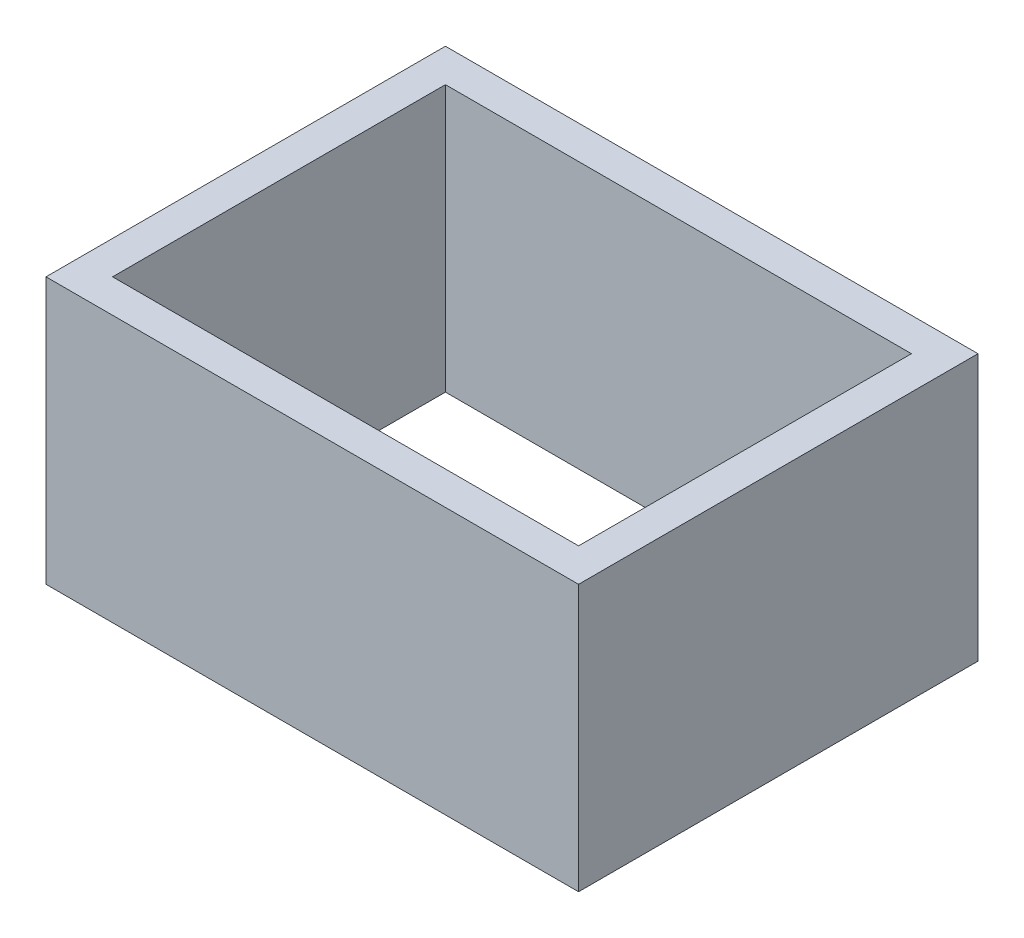
ISO-10303-21;
HEADER;
FILE_DESCRIPTION(('STEP AP214'),'2;1');
FILE_NAME('part.step','',(''),(''),'','','');
FILE_SCHEMA(('AUTOMOTIVE_DESIGN { 1 0 10303 214 1 1 1 1 }'));
ENDSEC;
DATA;
#1=APPLICATION_CONTEXT('core data for automotive mechanical design processes');
#2=APPLICATION_PROTOCOL_DEFINITION('international standard','automotive_design',2000,#1);
#3=PRODUCT_CONTEXT('',#1,'mechanical');
#4=PRODUCT('Part','Part','',(#3));
#5=PRODUCT_RELATED_PRODUCT_CATEGORY('part','',(#4));
#6=PRODUCT_DEFINITION_FORMATION('','',#4);
#7=PRODUCT_DEFINITION_CONTEXT('part definition',#1,'design');
#8=PRODUCT_DEFINITION('design','',#6,#7);
#9=PRODUCT_DEFINITION_SHAPE('','',#8);
#10=(LENGTH_UNIT() NAMED_UNIT(*) SI_UNIT(.MILLI.,.METRE.));
#11=(NAMED_UNIT(*) PLANE_ANGLE_UNIT() SI_UNIT($,.RADIAN.));
#12=(NAMED_UNIT(*) SI_UNIT($,.STERADIAN.) SOLID_ANGLE_UNIT());
#13=UNCERTAINTY_MEASURE_WITH_UNIT(LENGTH_MEASURE(1.E-05),#10,'distance_accuracy_value','');
#14=(GEOMETRIC_REPRESENTATION_CONTEXT(3) GLOBAL_UNCERTAINTY_ASSIGNED_CONTEXT((#13)) GLOBAL_UNIT_ASSIGNED_CONTEXT((#10,
#11,#12)) REPRESENTATION_CONTEXT('',''));
#15=CARTESIAN_POINT('',(0.,0.,0.));
#16=DIRECTION('',(0.,0.,1.));
#17=DIRECTION('',(1.,0.,0.));
#18=AXIS2_PLACEMENT_3D('',#15,#16,#17);
#19=CARTESIAN_POINT('',(25.4,25.4,-19.05));
#20=DIRECTION('',(-1.,0.,0.));
#21=DIRECTION('',(0.,0.,1.));
#22=AXIS2_PLACEMENT_3D('',#19,#20,#21);
#23=PLANE('',#22);
#24=DIRECTION('',(0.,0.,-1.));
#25=VECTOR('',#24,1.);
#26=CARTESIAN_POINT('',(25.4,0.,-19.05));
#27=LINE('',#26,#25);
#28=CARTESIAN_POINT('',(25.4,0.,19.05));
#29=VERTEX_POINT('',#28);
#30=CARTESIAN_POINT('',(25.4,0.,-19.05));
#31=VERTEX_POINT('',#30);
#32=EDGE_CURVE('E145',#29,#31,#27,.T.);
#33=ORIENTED_EDGE('',*,*,#32,.T.);
#34=DIRECTION('',(0.,-1.,0.));
#35=VECTOR('',#34,1.);
#36=CARTESIAN_POINT('',(25.4,25.4,-19.05));
#37=LINE('',#36,#35);
#38=CARTESIAN_POINT('',(25.4,25.4,-19.05));
#39=VERTEX_POINT('',#38);
#40=EDGE_CURVE('E11',#39,#31,#37,.T.);
#41=ORIENTED_EDGE('',*,*,#40,.F.);
#42=DIRECTION('',(0.,0.,-1.));
#43=VECTOR('',#42,1.);
#44=CARTESIAN_POINT('',(25.4,25.4,-19.05));
#45=LINE('',#44,#43);
#46=CARTESIAN_POINT('',(25.4,25.4,19.05));
#47=VERTEX_POINT('',#46);
#48=EDGE_CURVE('E134',#47,#39,#45,.T.);
#49=ORIENTED_EDGE('',*,*,#48,.F.);
#50=DIRECTION('',(0.,-1.,0.));
#51=VECTOR('',#50,1.);
#52=CARTESIAN_POINT('',(25.4,25.4,19.05));
#53=LINE('',#52,#51);
#54=EDGE_CURVE('E144',#47,#29,#53,.T.);
#55=ORIENTED_EDGE('',*,*,#54,.T.);
#56=EDGE_LOOP('',(#33,#41,#49,#55));
#57=FACE_BOUND('',#56,.T.);
#58=ADVANCED_FACE('F37',(#57),#23,.F.);
#59=CARTESIAN_POINT('',(-25.4,25.4,-19.05));
#60=DIRECTION('',(0.,0.,1.));
#61=DIRECTION('',(1.,0.,0.));
#62=AXIS2_PLACEMENT_3D('',#59,#60,#61);
#63=PLANE('',#62);
#64=DIRECTION('',(-1.,0.,0.));
#65=VECTOR('',#64,1.);
#66=CARTESIAN_POINT('',(-25.4,0.,-19.05));
#67=LINE('',#66,#65);
#68=CARTESIAN_POINT('',(-25.4,0.,-19.05));
#69=VERTEX_POINT('',#68);
#70=EDGE_CURVE('E148',#31,#69,#67,.T.);
#71=ORIENTED_EDGE('',*,*,#70,.T.);
#72=DIRECTION('',(0.,-1.,0.));
#73=VECTOR('',#72,1.);
#74=CARTESIAN_POINT('',(-25.4,25.4,-19.05));
#75=LINE('',#74,#73);
#76=CARTESIAN_POINT('',(-25.4,25.4,-19.05));
#77=VERTEX_POINT('',#76);
#78=EDGE_CURVE('E44',#77,#69,#75,.T.);
#79=ORIENTED_EDGE('',*,*,#78,.F.);
#80=DIRECTION('',(-1.,0.,0.));
#81=VECTOR('',#80,1.);
#82=CARTESIAN_POINT('',(-25.4,25.4,-19.05));
#83=LINE('',#82,#81);
#84=EDGE_CURVE('E137',#39,#77,#83,.T.);
#85=ORIENTED_EDGE('',*,*,#84,.F.);
#86=ORIENTED_EDGE('',*,*,#40,.T.);
#87=EDGE_LOOP('',(#71,#79,#85,#86));
#88=FACE_BOUND('',#87,.T.);
#89=ADVANCED_FACE('F176',(#88),#63,.F.);
#90=CARTESIAN_POINT('',(-25.4,25.4,-19.05));
#91=DIRECTION('',(1.,0.,0.));
#92=DIRECTION('',(0.,0.,-1.));
#93=AXIS2_PLACEMENT_3D('',#90,#91,#92);
#94=PLANE('',#93);
#95=DIRECTION('',(0.,0.,1.));
#96=VECTOR('',#95,1.);
#97=CARTESIAN_POINT('',(-25.4,0.,-19.05));
#98=LINE('',#97,#96);
#99=CARTESIAN_POINT('',(-25.4,0.,19.05));
#100=VERTEX_POINT('',#99);
#101=EDGE_CURVE('E150',#69,#100,#98,.T.);
#102=ORIENTED_EDGE('',*,*,#101,.T.);
#103=DIRECTION('',(0.,-1.,0.));
#104=VECTOR('',#103,1.);
#105=CARTESIAN_POINT('',(-25.4,25.4,19.05));
#106=LINE('',#105,#104);
#107=CARTESIAN_POINT('',(-25.4,25.4,19.05));
#108=VERTEX_POINT('',#107);
#109=EDGE_CURVE('E155',#108,#100,#106,.T.);
#110=ORIENTED_EDGE('',*,*,#109,.F.);
#111=DIRECTION('',(0.,0.,1.));
#112=VECTOR('',#111,1.);
#113=CARTESIAN_POINT('',(-25.4,25.4,-19.05));
#114=LINE('',#113,#112);
#115=EDGE_CURVE('E140',#77,#108,#114,.T.);
#116=ORIENTED_EDGE('',*,*,#115,.F.);
#117=ORIENTED_EDGE('',*,*,#78,.T.);
#118=EDGE_LOOP('',(#102,#110,#116,#117));
#119=FACE_BOUND('',#118,.T.);
#120=ADVANCED_FACE('F162',(#119),#94,.F.);
#121=CARTESIAN_POINT('',(-25.4,25.4,19.05));
#122=DIRECTION('',(0.,0.,-1.));
#123=DIRECTION('',(-1.,0.,0.));
#124=AXIS2_PLACEMENT_3D('',#121,#122,#123);
#125=PLANE('',#124);
#126=DIRECTION('',(1.,0.,0.));
#127=VECTOR('',#126,1.);
#128=CARTESIAN_POINT('',(-25.4,0.,19.05));
#129=LINE('',#128,#127);
#130=EDGE_CURVE('E138',#100,#29,#129,.T.);
#131=ORIENTED_EDGE('',*,*,#130,.T.);
#132=ORIENTED_EDGE('',*,*,#54,.F.);
#133=DIRECTION('',(1.,0.,0.));
#134=VECTOR('',#133,1.);
#135=CARTESIAN_POINT('',(-25.4,25.4,19.05));
#136=LINE('',#135,#134);
#137=EDGE_CURVE('E142',#108,#47,#136,.T.);
#138=ORIENTED_EDGE('',*,*,#137,.F.);
#139=ORIENTED_EDGE('',*,*,#109,.T.);
#140=EDGE_LOOP('',(#131,#132,#138,#139));
#141=FACE_BOUND('',#140,.T.);
#142=ADVANCED_FACE('F169',(#141),#125,.F.);
#143=CARTESIAN_POINT('',(0.,25.4,0.));
#144=DIRECTION('',(0.,1.,0.));
#145=DIRECTION('',(0.,0.,1.));
#146=AXIS2_PLACEMENT_3D('',#143,#144,#145);
#147=PLANE('',#146);
#148=DIRECTION('',(0.,0.,-1.));
#149=VECTOR('',#148,1.);
#150=CARTESIAN_POINT('',(22.225,25.4,-19.05));
#151=LINE('',#150,#149);
#152=CARTESIAN_POINT('',(22.225,25.4,15.875));
#153=VERTEX_POINT('',#152);
#154=CARTESIAN_POINT('',(22.225,25.4,-15.875));
#155=VERTEX_POINT('',#154);
#156=EDGE_CURVE('E122',#153,#155,#151,.T.);
#157=ORIENTED_EDGE('',*,*,#156,.F.);
#158=DIRECTION('',(1.,0.,0.));
#159=VECTOR('',#158,1.);
#160=CARTESIAN_POINT('',(-25.4,25.4,15.875));
#161=LINE('',#160,#159);
#162=CARTESIAN_POINT('',(-22.225,25.4,15.875));
#163=VERTEX_POINT('',#162);
#164=EDGE_CURVE('E106',#163,#153,#161,.T.);
#165=ORIENTED_EDGE('',*,*,#164,.F.);
#166=DIRECTION('',(0.,0.,1.));
#167=VECTOR('',#166,1.);
#168=CARTESIAN_POINT('',(-22.225,25.4,-19.05));
#169=LINE('',#168,#167);
#170=CARTESIAN_POINT('',(-22.225,25.4,-15.875));
#171=VERTEX_POINT('',#170);
#172=EDGE_CURVE('E131',#171,#163,#169,.T.);
#173=ORIENTED_EDGE('',*,*,#172,.F.);
#174=DIRECTION('',(-1.,0.,0.));
#175=VECTOR('',#174,1.);
#176=CARTESIAN_POINT('',(-25.4,25.4,-15.875));
#177=LINE('',#176,#175);
#178=EDGE_CURVE('E124',#155,#171,#177,.T.);
#179=ORIENTED_EDGE('',*,*,#178,.F.);
#180=EDGE_LOOP('',(#157,#165,#173,#179));
#181=FACE_BOUND('',#180,.T.);
#182=ORIENTED_EDGE('',*,*,#48,.T.);
#183=ORIENTED_EDGE('',*,*,#84,.T.);
#184=ORIENTED_EDGE('',*,*,#115,.T.);
#185=ORIENTED_EDGE('',*,*,#137,.T.);
#186=EDGE_LOOP('',(#182,#183,#184,#185));
#187=FACE_BOUND('',#186,.T.);
#188=ADVANCED_FACE('F175',(#181,#187),#147,.T.);
#189=CARTESIAN_POINT('',(0.,0.,0.));
#190=DIRECTION('',(0.,1.,0.));
#191=DIRECTION('',(0.,0.,1.));
#192=AXIS2_PLACEMENT_3D('',#189,#190,#191);
#193=PLANE('',#192);
#194=DIRECTION('',(1.,0.,0.));
#195=VECTOR('',#194,1.);
#196=CARTESIAN_POINT('',(-25.4,0.,15.875));
#197=LINE('',#196,#195);
#198=CARTESIAN_POINT('',(-22.225,0.,15.875));
#199=VERTEX_POINT('',#198);
#200=CARTESIAN_POINT('',(22.225,0.,15.875));
#201=VERTEX_POINT('',#200);
#202=EDGE_CURVE('E104',#199,#201,#197,.T.);
#203=ORIENTED_EDGE('',*,*,#202,.T.);
#204=DIRECTION('',(0.,0.,-1.));
#205=VECTOR('',#204,1.);
#206=CARTESIAN_POINT('',(22.225,0.,-19.05));
#207=LINE('',#206,#205);
#208=CARTESIAN_POINT('',(22.225,0.,-15.875));
#209=VERTEX_POINT('',#208);
#210=EDGE_CURVE('E112',#201,#209,#207,.T.);
#211=ORIENTED_EDGE('',*,*,#210,.T.);
#212=DIRECTION('',(-1.,0.,0.));
#213=VECTOR('',#212,1.);
#214=CARTESIAN_POINT('',(-25.4,0.,-15.875));
#215=LINE('',#214,#213);
#216=CARTESIAN_POINT('',(-22.225,0.,-15.875));
#217=VERTEX_POINT('',#216);
#218=EDGE_CURVE('E118',#209,#217,#215,.T.);
#219=ORIENTED_EDGE('',*,*,#218,.T.);
#220=DIRECTION('',(0.,0.,1.));
#221=VECTOR('',#220,1.);
#222=CARTESIAN_POINT('',(-22.225,0.,-19.05));
#223=LINE('',#222,#221);
#224=EDGE_CURVE('E58',#217,#199,#223,.T.);
#225=ORIENTED_EDGE('',*,*,#224,.T.);
#226=EDGE_LOOP('',(#203,#211,#219,#225));
#227=FACE_BOUND('',#226,.T.);
#228=ORIENTED_EDGE('',*,*,#32,.F.);
#229=ORIENTED_EDGE('',*,*,#130,.F.);
#230=ORIENTED_EDGE('',*,*,#101,.F.);
#231=ORIENTED_EDGE('',*,*,#70,.F.);
#232=EDGE_LOOP('',(#228,#229,#230,#231));
#233=FACE_BOUND('',#232,.T.);
#234=ADVANCED_FACE('F120',(#227,#233),#193,.F.);
#235=CARTESIAN_POINT('',(22.225,25.4,-19.05));
#236=DIRECTION('',(-1.,0.,0.));
#237=DIRECTION('',(0.,0.,1.));
#238=AXIS2_PLACEMENT_3D('',#235,#236,#237);
#239=PLANE('',#238);
#240=ORIENTED_EDGE('',*,*,#210,.F.);
#241=DIRECTION('',(0.,-1.,0.));
#242=VECTOR('',#241,1.);
#243=CARTESIAN_POINT('',(22.225,25.4,15.875));
#244=LINE('',#243,#242);
#245=EDGE_CURVE('E100',#153,#201,#244,.T.);
#246=ORIENTED_EDGE('',*,*,#245,.F.);
#247=ORIENTED_EDGE('',*,*,#156,.T.);
#248=DIRECTION('',(0.,-1.,0.));
#249=VECTOR('',#248,1.);
#250=CARTESIAN_POINT('',(22.225,25.4,-15.875));
#251=LINE('',#250,#249);
#252=EDGE_CURVE('E115',#155,#209,#251,.T.);
#253=ORIENTED_EDGE('',*,*,#252,.T.);
#254=EDGE_LOOP('',(#240,#246,#247,#253));
#255=FACE_BOUND('',#254,.T.);
#256=ADVANCED_FACE('F113',(#255),#239,.T.);
#257=CARTESIAN_POINT('',(-25.4,25.4,-15.875));
#258=DIRECTION('',(0.,0.,1.));
#259=DIRECTION('',(1.,0.,0.));
#260=AXIS2_PLACEMENT_3D('',#257,#258,#259);
#261=PLANE('',#260);
#262=ORIENTED_EDGE('',*,*,#218,.F.);
#263=ORIENTED_EDGE('',*,*,#252,.F.);
#264=ORIENTED_EDGE('',*,*,#178,.T.);
#265=DIRECTION('',(0.,-1.,0.));
#266=VECTOR('',#265,1.);
#267=CARTESIAN_POINT('',(-22.225,25.4,-15.875));
#268=LINE('',#267,#266);
#269=EDGE_CURVE('E280',#171,#217,#268,.T.);
#270=ORIENTED_EDGE('',*,*,#269,.T.);
#271=EDGE_LOOP('',(#262,#263,#264,#270));
#272=FACE_BOUND('',#271,.T.);
#273=ADVANCED_FACE('F196',(#272),#261,.T.);
#274=CARTESIAN_POINT('',(-22.225,25.4,-19.05));
#275=DIRECTION('',(1.,0.,0.));
#276=DIRECTION('',(0.,0.,-1.));
#277=AXIS2_PLACEMENT_3D('',#274,#275,#276);
#278=PLANE('',#277);
#279=ORIENTED_EDGE('',*,*,#224,.F.);
#280=ORIENTED_EDGE('',*,*,#269,.F.);
#281=ORIENTED_EDGE('',*,*,#172,.T.);
#282=DIRECTION('',(0.,-1.,0.));
#283=VECTOR('',#282,1.);
#284=CARTESIAN_POINT('',(-22.225,25.4,15.875));
#285=LINE('',#284,#283);
#286=EDGE_CURVE('E51',#163,#199,#285,.T.);
#287=ORIENTED_EDGE('',*,*,#286,.T.);
#288=EDGE_LOOP('',(#279,#280,#281,#287));
#289=FACE_BOUND('',#288,.T.);
#290=ADVANCED_FACE('F193',(#289),#278,.T.);
#291=CARTESIAN_POINT('',(-25.4,25.4,15.875));
#292=DIRECTION('',(0.,0.,-1.));
#293=DIRECTION('',(-1.,0.,0.));
#294=AXIS2_PLACEMENT_3D('',#291,#292,#293);
#295=PLANE('',#294);
#296=ORIENTED_EDGE('',*,*,#202,.F.);
#297=ORIENTED_EDGE('',*,*,#286,.F.);
#298=ORIENTED_EDGE('',*,*,#164,.T.);
#299=ORIENTED_EDGE('',*,*,#245,.T.);
#300=EDGE_LOOP('',(#296,#297,#298,#299));
#301=FACE_BOUND('',#300,.T.);
#302=ADVANCED_FACE('F102',(#301),#295,.T.);
#303=CLOSED_SHELL('',(#58,#89,#120,#142,#188,#234,#256,#273,#290,#302));
#304=MANIFOLD_SOLID_BREP('B2',#303);
#305=ADVANCED_BREP_SHAPE_REPRESENTATION('',(#18,#304),#14);
#306=SHAPE_DEFINITION_REPRESENTATION(#9,#305);
ENDSEC;
END-ISO-10303-21;
